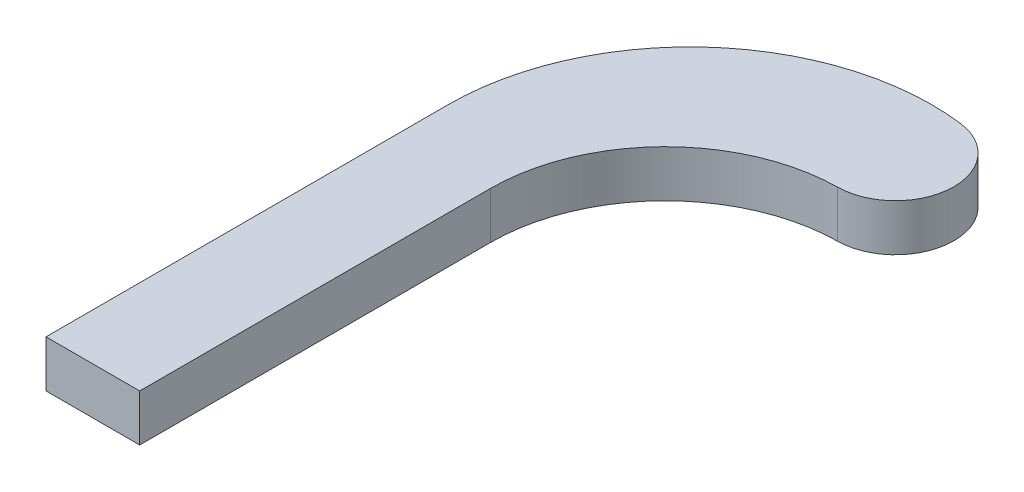
ISO-10303-21;
HEADER;
FILE_DESCRIPTION(('STEP AP214'),'2;1');
FILE_NAME('part.step','',(''),(''),'','','');
FILE_SCHEMA(('AUTOMOTIVE_DESIGN { 1 0 10303 214 1 1 1 1 }'));
ENDSEC;
DATA;
#1=APPLICATION_CONTEXT('core data for automotive mechanical design processes');
#2=APPLICATION_PROTOCOL_DEFINITION('international standard','automotive_design',2000,#1);
#3=PRODUCT_CONTEXT('',#1,'mechanical');
#4=PRODUCT('Part','Part','',(#3));
#5=PRODUCT_RELATED_PRODUCT_CATEGORY('part','',(#4));
#6=PRODUCT_DEFINITION_FORMATION('','',#4);
#7=PRODUCT_DEFINITION_CONTEXT('part definition',#1,'design');
#8=PRODUCT_DEFINITION('design','',#6,#7);
#9=PRODUCT_DEFINITION_SHAPE('','',#8);
#10=(LENGTH_UNIT() NAMED_UNIT(*) SI_UNIT(.MILLI.,.METRE.));
#11=(NAMED_UNIT(*) PLANE_ANGLE_UNIT() SI_UNIT($,.RADIAN.));
#12=(NAMED_UNIT(*) SI_UNIT($,.STERADIAN.) SOLID_ANGLE_UNIT());
#13=UNCERTAINTY_MEASURE_WITH_UNIT(LENGTH_MEASURE(1.E-05),#10,'distance_accuracy_value','');
#14=(GEOMETRIC_REPRESENTATION_CONTEXT(3) GLOBAL_UNCERTAINTY_ASSIGNED_CONTEXT((#13)) GLOBAL_UNIT_ASSIGNED_CONTEXT((#10,
#11,#12)) REPRESENTATION_CONTEXT('',''));
#15=CARTESIAN_POINT('',(0.,0.,0.));
#16=DIRECTION('',(0.,0.,1.));
#17=DIRECTION('',(1.,0.,0.));
#18=AXIS2_PLACEMENT_3D('',#15,#16,#17);
#19=CARTESIAN_POINT('',(-19.05,19.05,0.));
#20=DIRECTION('',(0.,0.,-1.));
#21=DIRECTION('',(-1.,0.,0.));
#22=AXIS2_PLACEMENT_3D('',#19,#20,#21);
#23=PLANE('',#22);
#24=DIRECTION('',(1.,0.,0.));
#25=VECTOR('',#24,1.);
#26=CARTESIAN_POINT('',(-19.05,0.,0.));
#27=LINE('',#26,#25);
#28=CARTESIAN_POINT('',(-19.05,0.,0.));
#29=VERTEX_POINT('',#28);
#30=CARTESIAN_POINT('',(19.05,0.,0.));
#31=VERTEX_POINT('',#30);
#32=EDGE_CURVE('E121',#29,#31,#27,.T.);
#33=ORIENTED_EDGE('',*,*,#32,.T.);
#34=DIRECTION('',(0.,-1.,0.));
#35=VECTOR('',#34,1.);
#36=CARTESIAN_POINT('',(19.05,19.05,0.));
#37=LINE('',#36,#35);
#38=CARTESIAN_POINT('',(19.05,19.05,0.));
#39=VERTEX_POINT('',#38);
#40=EDGE_CURVE('E41',#39,#31,#37,.T.);
#41=ORIENTED_EDGE('',*,*,#40,.F.);
#42=DIRECTION('',(1.,0.,0.));
#43=VECTOR('',#42,1.);
#44=CARTESIAN_POINT('',(-19.05,19.05,0.));
#45=LINE('',#44,#43);
#46=CARTESIAN_POINT('',(-19.05,19.05,0.));
#47=VERTEX_POINT('',#46);
#48=EDGE_CURVE('E87',#47,#39,#45,.T.);
#49=ORIENTED_EDGE('',*,*,#48,.F.);
#50=DIRECTION('',(0.,-1.,0.));
#51=VECTOR('',#50,1.);
#52=CARTESIAN_POINT('',(-19.05,19.05,0.));
#53=LINE('',#52,#51);
#54=EDGE_CURVE('E11',#47,#29,#53,.T.);
#55=ORIENTED_EDGE('',*,*,#54,.T.);
#56=EDGE_LOOP('',(#33,#41,#49,#55));
#57=FACE_BOUND('',#56,.T.);
#58=ADVANCED_FACE('F33',(#57),#23,.F.);
#59=CARTESIAN_POINT('',(19.05,19.05,0.));
#60=DIRECTION('',(-1.,0.,0.));
#61=DIRECTION('',(0.,0.,1.));
#62=AXIS2_PLACEMENT_3D('',#59,#60,#61);
#63=PLANE('',#62);
#64=DIRECTION('',(0.,0.,-1.));
#65=VECTOR('',#64,1.);
#66=CARTESIAN_POINT('',(19.05,0.,0.));
#67=LINE('',#66,#65);
#68=CARTESIAN_POINT('',(19.05,0.,-142.604993732559));
#69=VERTEX_POINT('',#68);
#70=EDGE_CURVE('E123',#31,#69,#67,.T.);
#71=ORIENTED_EDGE('',*,*,#70,.T.);
#72=DIRECTION('',(0.,-1.,0.));
#73=VECTOR('',#72,1.);
#74=CARTESIAN_POINT('',(19.05,19.05,-142.604993732559));
#75=LINE('',#74,#73);
#76=CARTESIAN_POINT('',(19.05,19.05,-142.604993732559));
#77=VERTEX_POINT('',#76);
#78=EDGE_CURVE('E110',#77,#69,#75,.T.);
#79=ORIENTED_EDGE('',*,*,#78,.F.);
#80=DIRECTION('',(0.,0.,-1.));
#81=VECTOR('',#80,1.);
#82=CARTESIAN_POINT('',(19.05,19.05,0.));
#83=LINE('',#82,#81);
#84=EDGE_CURVE('E101',#39,#77,#83,.T.);
#85=ORIENTED_EDGE('',*,*,#84,.F.);
#86=ORIENTED_EDGE('',*,*,#40,.T.);
#87=EDGE_LOOP('',(#71,#79,#85,#86));
#88=FACE_BOUND('',#87,.T.);
#89=ADVANCED_FACE('F135',(#88),#63,.F.);
#90=CARTESIAN_POINT('',(90.1203800415775,19.05,-142.604993732559));
#91=DIRECTION('',(0.,-1.,0.));
#92=DIRECTION('',(0.,0.,-1.));
#93=AXIS2_PLACEMENT_3D('',#90,#91,#92);
#94=CYLINDRICAL_SURFACE('',#93,71.0703800415775);
#95=CARTESIAN_POINT('',(90.1203800415775,0.,-142.604993732559));
#96=DIRECTION('',(0.,-1.,0.));
#97=DIRECTION('',(0.,0.,-1.));
#98=AXIS2_PLACEMENT_3D('',#95,#96,#97);
#99=CIRCLE('',#98,71.0703800415775);
#100=CARTESIAN_POINT('',(89.2060525957919,0.,-213.66949207439));
#101=VERTEX_POINT('',#100);
#102=EDGE_CURVE('E109',#69,#101,#99,.T.);
#103=ORIENTED_EDGE('',*,*,#102,.T.);
#104=DIRECTION('',(0.,-1.,0.));
#105=VECTOR('',#104,1.);
#106=CARTESIAN_POINT('',(89.2060525957919,19.05,-213.66949207439));
#107=LINE('',#106,#105);
#108=CARTESIAN_POINT('',(89.2060525957919,19.05,-213.66949207439));
#109=VERTEX_POINT('',#108);
#110=EDGE_CURVE('E106',#109,#101,#107,.T.);
#111=ORIENTED_EDGE('',*,*,#110,.F.);
#112=CARTESIAN_POINT('',(90.1203800415775,19.05,-142.604993732559));
#113=DIRECTION('',(0.,-1.,0.));
#114=DIRECTION('',(0.,0.,-1.));
#115=AXIS2_PLACEMENT_3D('',#112,#113,#114);
#116=CIRCLE('',#115,71.0703800415775);
#117=EDGE_CURVE('E95',#77,#109,#116,.T.);
#118=ORIENTED_EDGE('',*,*,#117,.F.);
#119=ORIENTED_EDGE('',*,*,#78,.T.);
#120=EDGE_LOOP('',(#103,#111,#118,#119));
#121=FACE_BOUND('',#120,.T.);
#122=ADVANCED_FACE('F107',(#121),#94,.F.);
#123=CARTESIAN_POINT('',(88.8999999999999,19.05,-237.456893717444));
#124=DIRECTION('',(0.,-1.,0.));
#125=DIRECTION('',(0.,0.,-1.));
#126=AXIS2_PLACEMENT_3D('',#123,#124,#125);
#127=CYLINDRICAL_SURFACE('',#126,23.7893704229299);
#128=CARTESIAN_POINT('',(88.8999999999999,0.,-237.456893717444));
#129=DIRECTION('',(0.,1.,0.));
#130=DIRECTION('',(0.,0.,1.));
#131=AXIS2_PLACEMENT_3D('',#128,#129,#130);
#132=CIRCLE('',#131,23.7893704229299);
#133=CARTESIAN_POINT('',(91.949229986742,0.,-261.050035551616));
#134=VERTEX_POINT('',#133);
#135=EDGE_CURVE('E73',#101,#134,#132,.T.);
#136=ORIENTED_EDGE('',*,*,#135,.T.);
#137=DIRECTION('',(0.,-1.,0.));
#138=VECTOR('',#137,1.);
#139=CARTESIAN_POINT('',(91.949229986742,19.05,-261.050035551616));
#140=LINE('',#139,#138);
#141=CARTESIAN_POINT('',(91.949229986742,19.05,-261.050035551616));
#142=VERTEX_POINT('',#141);
#143=EDGE_CURVE('E111',#142,#134,#140,.T.);
#144=ORIENTED_EDGE('',*,*,#143,.F.);
#145=CARTESIAN_POINT('',(88.8999999999999,19.05,-237.456893717444));
#146=DIRECTION('',(0.,1.,0.));
#147=DIRECTION('',(0.,0.,1.));
#148=AXIS2_PLACEMENT_3D('',#145,#146,#147);
#149=CIRCLE('',#148,23.7893704229299);
#150=EDGE_CURVE('E99',#109,#142,#149,.T.);
#151=ORIENTED_EDGE('',*,*,#150,.F.);
#152=ORIENTED_EDGE('',*,*,#110,.T.);
#153=EDGE_LOOP('',(#136,#144,#151,#152));
#154=FACE_BOUND('',#153,.T.);
#155=ADVANCED_FACE('F113',(#154),#127,.T.);
#156=CARTESIAN_POINT('',(79.338207973132,19.05,-163.473390846356));
#157=DIRECTION('',(0.,-1.,0.));
#158=DIRECTION('',(0.,0.,-1.));
#159=AXIS2_PLACEMENT_3D('',#156,#157,#158);
#160=CYLINDRICAL_SURFACE('',#159,98.388207973132);
#161=CARTESIAN_POINT('',(79.338207973132,0.,-163.473390846356));
#162=DIRECTION('',(0.,1.,0.));
#163=DIRECTION('',(0.,0.,-1.));
#164=AXIS2_PLACEMENT_3D('',#161,#162,#163);
#165=CIRCLE('',#164,98.388207973132);
#166=CARTESIAN_POINT('',(-19.05,0.,-163.473390846356));
#167=VERTEX_POINT('',#166);
#168=EDGE_CURVE('E80',#134,#167,#165,.T.);
#169=ORIENTED_EDGE('',*,*,#168,.T.);
#170=DIRECTION('',(0.,-1.,0.));
#171=VECTOR('',#170,1.);
#172=CARTESIAN_POINT('',(-19.05,19.05,-163.473390846356));
#173=LINE('',#172,#171);
#174=CARTESIAN_POINT('',(-19.05,19.05,-163.473390846356));
#175=VERTEX_POINT('',#174);
#176=EDGE_CURVE('E117',#175,#167,#173,.T.);
#177=ORIENTED_EDGE('',*,*,#176,.F.);
#178=CARTESIAN_POINT('',(79.338207973132,19.05,-163.473390846356));
#179=DIRECTION('',(0.,1.,0.));
#180=DIRECTION('',(0.,0.,-1.));
#181=AXIS2_PLACEMENT_3D('',#178,#179,#180);
#182=CIRCLE('',#181,98.388207973132);
#183=EDGE_CURVE('E115',#142,#175,#182,.T.);
#184=ORIENTED_EDGE('',*,*,#183,.F.);
#185=ORIENTED_EDGE('',*,*,#143,.T.);
#186=EDGE_LOOP('',(#169,#177,#184,#185));
#187=FACE_BOUND('',#186,.T.);
#188=ADVANCED_FACE('F141',(#187),#160,.T.);
#189=CARTESIAN_POINT('',(-19.05,19.05,-142.604993732559));
#190=DIRECTION('',(1.,0.,0.));
#191=DIRECTION('',(0.,0.,-1.));
#192=AXIS2_PLACEMENT_3D('',#189,#190,#191);
#193=PLANE('',#192);
#194=DIRECTION('',(0.,0.,1.));
#195=VECTOR('',#194,1.);
#196=CARTESIAN_POINT('',(-19.05,0.,-142.604993732559));
#197=LINE('',#196,#195);
#198=EDGE_CURVE('E128',#167,#29,#197,.T.);
#199=ORIENTED_EDGE('',*,*,#198,.T.);
#200=ORIENTED_EDGE('',*,*,#54,.F.);
#201=DIRECTION('',(0.,0.,1.));
#202=VECTOR('',#201,1.);
#203=CARTESIAN_POINT('',(-19.05,19.05,0.));
#204=LINE('',#203,#202);
#205=EDGE_CURVE('E49',#175,#47,#204,.T.);
#206=ORIENTED_EDGE('',*,*,#205,.F.);
#207=ORIENTED_EDGE('',*,*,#176,.T.);
#208=EDGE_LOOP('',(#199,#200,#206,#207));
#209=FACE_BOUND('',#208,.T.);
#210=ADVANCED_FACE('F140',(#209),#193,.F.);
#211=CARTESIAN_POINT('',(79.338207973132,19.05,-163.473390846356));
#212=DIRECTION('',(0.,-1.,0.));
#213=DIRECTION('',(0.,0.,-1.));
#214=AXIS2_PLACEMENT_3D('',#211,#212,#213);
#215=PLANE('',#214);
#216=ORIENTED_EDGE('',*,*,#205,.T.);
#217=ORIENTED_EDGE('',*,*,#48,.T.);
#218=ORIENTED_EDGE('',*,*,#84,.T.);
#219=ORIENTED_EDGE('',*,*,#117,.T.);
#220=ORIENTED_EDGE('',*,*,#150,.T.);
#221=ORIENTED_EDGE('',*,*,#183,.T.);
#222=EDGE_LOOP('',(#216,#217,#218,#219,#220,#221));
#223=FACE_BOUND('',#222,.T.);
#224=ADVANCED_FACE('F97',(#223),#215,.F.);
#225=CARTESIAN_POINT('',(79.338207973132,0.,-163.473390846356));
#226=DIRECTION('',(0.,-1.,0.));
#227=DIRECTION('',(0.,0.,-1.));
#228=AXIS2_PLACEMENT_3D('',#225,#226,#227);
#229=PLANE('',#228);
#230=ORIENTED_EDGE('',*,*,#32,.F.);
#231=ORIENTED_EDGE('',*,*,#198,.F.);
#232=ORIENTED_EDGE('',*,*,#168,.F.);
#233=ORIENTED_EDGE('',*,*,#135,.F.);
#234=ORIENTED_EDGE('',*,*,#102,.F.);
#235=ORIENTED_EDGE('',*,*,#70,.F.);
#236=EDGE_LOOP('',(#230,#231,#232,#233,#234,#235));
#237=FACE_BOUND('',#236,.T.);
#238=ADVANCED_FACE('F138',(#237),#229,.T.);
#239=CLOSED_SHELL('',(#58,#89,#122,#155,#188,#210,#224,#238));
#240=MANIFOLD_SOLID_BREP('B2',#239);
#241=ADVANCED_BREP_SHAPE_REPRESENTATION('',(#18,#240),#14);
#242=SHAPE_DEFINITION_REPRESENTATION(#9,#241);
ENDSEC;
END-ISO-10303-21;
